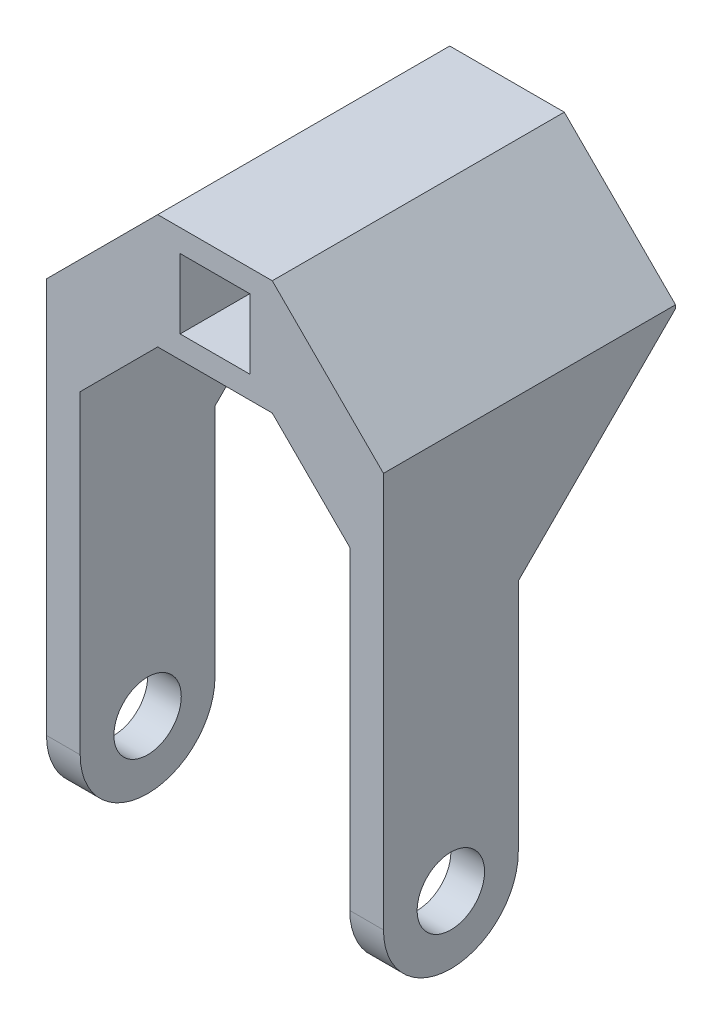
ISO-10303-21;
HEADER;
FILE_DESCRIPTION(('STEP AP214'),'2;1');
FILE_NAME('part.step','',(''),(''),'','','');
FILE_SCHEMA(('AUTOMOTIVE_DESIGN { 1 0 10303 214 1 1 1 1 }'));
ENDSEC;
DATA;
#1=APPLICATION_CONTEXT('core data for automotive mechanical design processes');
#2=APPLICATION_PROTOCOL_DEFINITION('international standard','automotive_design',2000,#1);
#3=PRODUCT_CONTEXT('',#1,'mechanical');
#4=PRODUCT('Part','Part','',(#3));
#5=PRODUCT_RELATED_PRODUCT_CATEGORY('part','',(#4));
#6=PRODUCT_DEFINITION_FORMATION('','',#4);
#7=PRODUCT_DEFINITION_CONTEXT('part definition',#1,'design');
#8=PRODUCT_DEFINITION('design','',#6,#7);
#9=PRODUCT_DEFINITION_SHAPE('','',#8);
#10=(LENGTH_UNIT() NAMED_UNIT(*) SI_UNIT(.MILLI.,.METRE.));
#11=(NAMED_UNIT(*) PLANE_ANGLE_UNIT() SI_UNIT($,.RADIAN.));
#12=(NAMED_UNIT(*) SI_UNIT($,.STERADIAN.) SOLID_ANGLE_UNIT());
#13=UNCERTAINTY_MEASURE_WITH_UNIT(LENGTH_MEASURE(1.E-05),#10,'distance_accuracy_value','');
#14=(GEOMETRIC_REPRESENTATION_CONTEXT(3) GLOBAL_UNCERTAINTY_ASSIGNED_CONTEXT((#13)) GLOBAL_UNIT_ASSIGNED_CONTEXT((#10,
#11,#12)) REPRESENTATION_CONTEXT('',''));
#15=CARTESIAN_POINT('',(0.,0.,0.));
#16=DIRECTION('',(0.,0.,1.));
#17=DIRECTION('',(1.,0.,0.));
#18=AXIS2_PLACEMENT_3D('',#15,#16,#17);
#19=CARTESIAN_POINT('',(-75.,176.,-100.));
#20=DIRECTION('',(-0.707106781186546,0.707106781186549,0.));
#21=DIRECTION('',(-0.707106781186549,-0.707106781186546,0.));
#22=AXIS2_PLACEMENT_3D('',#19,#20,#21);
#23=PLANE('',#22);
#24=DIRECTION('',(0.,0.,1.));
#25=VECTOR('',#24,1.);
#26=CARTESIAN_POINT('',(-75.,176.,-100.));
#27=LINE('',#26,#25);
#28=CARTESIAN_POINT('',(-75.,176.,-100.));
#29=VERTEX_POINT('',#28);
#30=CARTESIAN_POINT('',(-75.,176.,30.));
#31=VERTEX_POINT('',#30);
#32=EDGE_CURVE('E228',#29,#31,#27,.T.);
#33=ORIENTED_EDGE('',*,*,#32,.T.);
#34=DIRECTION('',(-0.707106781186549,-0.707106781186546,0.));
#35=VECTOR('',#34,1.);
#36=CARTESIAN_POINT('',(-75.,176.,30.));
#37=LINE('',#36,#35);
#38=CARTESIAN_POINT('',(-25.5,225.5,30.));
#39=VERTEX_POINT('',#38);
#40=EDGE_CURVE('E323',#39,#31,#37,.T.);
#41=ORIENTED_EDGE('',*,*,#40,.F.);
#42=DIRECTION('',(0.,0.,1.));
#43=VECTOR('',#42,1.);
#44=CARTESIAN_POINT('',(-25.5,225.5,-100.));
#45=LINE('',#44,#43);
#46=CARTESIAN_POINT('',(-25.5,225.5,-100.));
#47=VERTEX_POINT('',#46);
#48=EDGE_CURVE('E196',#47,#39,#45,.T.);
#49=ORIENTED_EDGE('',*,*,#48,.F.);
#50=DIRECTION('',(-0.707106781186549,-0.707106781186546,0.));
#51=VECTOR('',#50,1.);
#52=CARTESIAN_POINT('',(-75.,176.,-100.));
#53=LINE('',#52,#51);
#54=EDGE_CURVE('E369',#47,#29,#53,.T.);
#55=ORIENTED_EDGE('',*,*,#54,.T.);
#56=EDGE_LOOP('',(#33,#41,#49,#55));
#57=FACE_BOUND('',#56,.T.);
#58=ADVANCED_FACE('F38',(#57),#23,.T.);
#59=CARTESIAN_POINT('',(25.5,225.5,-100.));
#60=DIRECTION('',(0.,1.,0.));
#61=DIRECTION('',(0.,0.,1.));
#62=AXIS2_PLACEMENT_3D('',#59,#60,#61);
#63=PLANE('',#62);
#64=ORIENTED_EDGE('',*,*,#48,.T.);
#65=DIRECTION('',(-1.,0.,0.));
#66=VECTOR('',#65,1.);
#67=CARTESIAN_POINT('',(25.5,225.5,30.));
#68=LINE('',#67,#66);
#69=CARTESIAN_POINT('',(25.5,225.5,30.));
#70=VERTEX_POINT('',#69);
#71=EDGE_CURVE('E345',#70,#39,#68,.T.);
#72=ORIENTED_EDGE('',*,*,#71,.F.);
#73=DIRECTION('',(0.,0.,1.));
#74=VECTOR('',#73,1.);
#75=CARTESIAN_POINT('',(25.5,225.5,-100.));
#76=LINE('',#75,#74);
#77=CARTESIAN_POINT('',(25.5,225.5,-100.));
#78=VERTEX_POINT('',#77);
#79=EDGE_CURVE('E231',#78,#70,#76,.T.);
#80=ORIENTED_EDGE('',*,*,#79,.F.);
#81=DIRECTION('',(-1.,0.,0.));
#82=VECTOR('',#81,1.);
#83=CARTESIAN_POINT('',(25.5,225.5,-100.));
#84=LINE('',#83,#82);
#85=EDGE_CURVE('E218',#78,#47,#84,.T.);
#86=ORIENTED_EDGE('',*,*,#85,.T.);
#87=EDGE_LOOP('',(#64,#72,#80,#86));
#88=FACE_BOUND('',#87,.T.);
#89=ADVANCED_FACE('F393',(#88),#63,.T.);
#90=CARTESIAN_POINT('',(75.,176.,-100.));
#91=DIRECTION('',(0.707106781186546,0.707106781186549,0.));
#92=DIRECTION('',(-0.707106781186549,0.707106781186546,0.));
#93=AXIS2_PLACEMENT_3D('',#90,#91,#92);
#94=PLANE('',#93);
#95=ORIENTED_EDGE('',*,*,#79,.T.);
#96=DIRECTION('',(-0.707106781186549,0.707106781186546,0.));
#97=VECTOR('',#96,1.);
#98=CARTESIAN_POINT('',(75.,176.,30.));
#99=LINE('',#98,#97);
#100=CARTESIAN_POINT('',(75.,176.,30.));
#101=VERTEX_POINT('',#100);
#102=EDGE_CURVE('E341',#101,#70,#99,.T.);
#103=ORIENTED_EDGE('',*,*,#102,.F.);
#104=DIRECTION('',(0.,0.,1.));
#105=VECTOR('',#104,1.);
#106=CARTESIAN_POINT('',(75.,176.,-100.));
#107=LINE('',#106,#105);
#108=CARTESIAN_POINT('',(75.,176.,-100.));
#109=VERTEX_POINT('',#108);
#110=EDGE_CURVE('E234',#109,#101,#107,.T.);
#111=ORIENTED_EDGE('',*,*,#110,.F.);
#112=DIRECTION('',(-0.707106781186549,0.707106781186546,0.));
#113=VECTOR('',#112,1.);
#114=CARTESIAN_POINT('',(75.,176.,-100.));
#115=LINE('',#114,#113);
#116=EDGE_CURVE('E212',#109,#78,#115,.T.);
#117=ORIENTED_EDGE('',*,*,#116,.T.);
#118=EDGE_LOOP('',(#95,#103,#111,#117));
#119=FACE_BOUND('',#118,.T.);
#120=ADVANCED_FACE('F397',(#119),#94,.T.);
#121=CARTESIAN_POINT('',(75.,-30.,-100.));
#122=DIRECTION('',(1.,0.,0.));
#123=DIRECTION('',(0.,0.,-1.));
#124=AXIS2_PLACEMENT_3D('',#121,#122,#123);
#125=PLANE('',#124);
#126=CARTESIAN_POINT('',(75.,0.,0.));
#127=DIRECTION('',(1.,0.,0.));
#128=DIRECTION('',(0.,0.,-1.));
#129=AXIS2_PLACEMENT_3D('',#126,#127,#128);
#130=CIRCLE('',#129,15.);
#131=CARTESIAN_POINT('',(75.,0.,-15.));
#132=VERTEX_POINT('',#131);
#133=EDGE_CURVE('E285',#132,#132,#130,.T.);
#134=ORIENTED_EDGE('',*,*,#133,.F.);
#135=EDGE_LOOP('',(#134));
#136=FACE_BOUND('',#135,.T.);
#137=CARTESIAN_POINT('',(75.,0.,0.));
#138=DIRECTION('',(1.,0.,0.));
#139=DIRECTION('',(0.,0.,-1.));
#140=AXIS2_PLACEMENT_3D('',#137,#138,#139);
#141=CIRCLE('',#140,30.);
#142=CARTESIAN_POINT('',(75.,0.,30.));
#143=VERTEX_POINT('',#142);
#144=CARTESIAN_POINT('',(75.,-30.,0.));
#145=VERTEX_POINT('',#144);
#146=EDGE_CURVE('E195',#143,#145,#141,.T.);
#147=ORIENTED_EDGE('',*,*,#146,.T.);
#148=CARTESIAN_POINT('',(75.,0.,0.));
#149=DIRECTION('',(1.,0.,0.));
#150=DIRECTION('',(0.,0.,-1.));
#151=AXIS2_PLACEMENT_3D('',#148,#149,#150);
#152=CIRCLE('',#151,30.);
#153=CARTESIAN_POINT('',(75.,0.,-30.));
#154=VERTEX_POINT('',#153);
#155=EDGE_CURVE('E254',#145,#154,#152,.T.);
#156=ORIENTED_EDGE('',*,*,#155,.T.);
#157=DIRECTION('',(0.,-1.,0.));
#158=VECTOR('',#157,1.);
#159=CARTESIAN_POINT('',(75.,-30.,-30.));
#160=LINE('',#159,#158);
#161=CARTESIAN_POINT('',(75.,104.499999999999,-30.));
#162=VERTEX_POINT('',#161);
#163=EDGE_CURVE('E204',#162,#154,#160,.T.);
#164=ORIENTED_EDGE('',*,*,#163,.F.);
#165=DIRECTION('',(0.,-0.707106781186551,0.707106781186544));
#166=VECTOR('',#165,1.);
#167=CARTESIAN_POINT('',(75.,104.499999999999,-30.));
#168=LINE('',#167,#166);
#169=CARTESIAN_POINT('',(75.,174.5,-100.));
#170=VERTEX_POINT('',#169);
#171=EDGE_CURVE('E186',#170,#162,#168,.T.);
#172=ORIENTED_EDGE('',*,*,#171,.F.);
#173=DIRECTION('',(0.,1.,0.));
#174=VECTOR('',#173,1.);
#175=CARTESIAN_POINT('',(75.,-30.,-100.));
#176=LINE('',#175,#174);
#177=EDGE_CURVE('E201',#170,#109,#176,.T.);
#178=ORIENTED_EDGE('',*,*,#177,.T.);
#179=ORIENTED_EDGE('',*,*,#110,.T.);
#180=DIRECTION('',(0.,1.,0.));
#181=VECTOR('',#180,1.);
#182=CARTESIAN_POINT('',(75.,-30.,30.));
#183=LINE('',#182,#181);
#184=EDGE_CURVE('E338',#143,#101,#183,.T.);
#185=ORIENTED_EDGE('',*,*,#184,.F.);
#186=EDGE_LOOP('',(#147,#156,#164,#172,#178,#179,#185));
#187=FACE_BOUND('',#186,.T.);
#188=ADVANCED_FACE('F199',(#136,#187),#125,.T.);
#189=CARTESIAN_POINT('',(60.,140.,-100.));
#190=DIRECTION('',(-1.,0.,0.));
#191=DIRECTION('',(0.,-1.,0.));
#192=AXIS2_PLACEMENT_3D('',#189,#190,#191);
#193=PLANE('',#192);
#194=CARTESIAN_POINT('',(60.,0.,0.));
#195=DIRECTION('',(-1.,0.,0.));
#196=DIRECTION('',(0.,-1.,0.));
#197=AXIS2_PLACEMENT_3D('',#194,#195,#196);
#198=CIRCLE('',#197,15.);
#199=CARTESIAN_POINT('',(60.,-15.,0.));
#200=VERTEX_POINT('',#199);
#201=EDGE_CURVE('E206',#200,#200,#198,.T.);
#202=ORIENTED_EDGE('',*,*,#201,.F.);
#203=EDGE_LOOP('',(#202));
#204=FACE_BOUND('',#203,.T.);
#205=DIRECTION('',(0.,1.,0.));
#206=VECTOR('',#205,1.);
#207=CARTESIAN_POINT('',(60.,140.,-30.));
#208=LINE('',#207,#206);
#209=CARTESIAN_POINT('',(60.,0.,-30.));
#210=VERTEX_POINT('',#209);
#211=CARTESIAN_POINT('',(60.,104.499999999999,-30.));
#212=VERTEX_POINT('',#211);
#213=EDGE_CURVE('E439',#210,#212,#208,.T.);
#214=ORIENTED_EDGE('',*,*,#213,.F.);
#215=CARTESIAN_POINT('',(60.,0.,0.));
#216=DIRECTION('',(-1.,0.,0.));
#217=DIRECTION('',(0.,-1.,0.));
#218=AXIS2_PLACEMENT_3D('',#215,#216,#217);
#219=CIRCLE('',#218,30.);
#220=CARTESIAN_POINT('',(60.,-30.,0.));
#221=VERTEX_POINT('',#220);
#222=EDGE_CURVE('E264',#210,#221,#219,.T.);
#223=ORIENTED_EDGE('',*,*,#222,.T.);
#224=CARTESIAN_POINT('',(60.,0.,0.));
#225=DIRECTION('',(-1.,0.,0.));
#226=DIRECTION('',(0.,-1.,0.));
#227=AXIS2_PLACEMENT_3D('',#224,#225,#226);
#228=CIRCLE('',#227,30.);
#229=CARTESIAN_POINT('',(60.,0.,30.));
#230=VERTEX_POINT('',#229);
#231=EDGE_CURVE('E261',#221,#230,#228,.T.);
#232=ORIENTED_EDGE('',*,*,#231,.T.);
#233=DIRECTION('',(0.,-1.,0.));
#234=VECTOR('',#233,1.);
#235=CARTESIAN_POINT('',(60.,140.,30.));
#236=LINE('',#235,#234);
#237=CARTESIAN_POINT('',(60.,140.,30.));
#238=VERTEX_POINT('',#237);
#239=EDGE_CURVE('E334',#238,#230,#236,.T.);
#240=ORIENTED_EDGE('',*,*,#239,.F.);
#241=DIRECTION('',(0.,0.,1.));
#242=VECTOR('',#241,1.);
#243=CARTESIAN_POINT('',(60.,140.,-100.));
#244=LINE('',#243,#242);
#245=CARTESIAN_POINT('',(60.,140.,-65.5000000000006));
#246=VERTEX_POINT('',#245);
#247=EDGE_CURVE('E237',#246,#238,#244,.T.);
#248=ORIENTED_EDGE('',*,*,#247,.F.);
#249=DIRECTION('',(0.,0.707106781186551,-0.707106781186544));
#250=VECTOR('',#249,1.);
#251=CARTESIAN_POINT('',(60.,157.25,-82.7500000000001));
#252=LINE('',#251,#250);
#253=EDGE_CURVE('E432',#212,#246,#252,.T.);
#254=ORIENTED_EDGE('',*,*,#253,.F.);
#255=EDGE_LOOP('',(#214,#223,#232,#240,#248,#254));
#256=FACE_BOUND('',#255,.T.);
#257=ADVANCED_FACE('F585',(#204,#256),#193,.T.);
#258=CARTESIAN_POINT('',(25.5,174.5,-100.));
#259=DIRECTION('',(-0.707106781186546,-0.707106781186549,0.));
#260=DIRECTION('',(0.707106781186549,-0.707106781186546,0.));
#261=AXIS2_PLACEMENT_3D('',#258,#259,#260);
#262=PLANE('',#261);
#263=DIRECTION('',(-0.57735026918963,0.577350269189627,-0.577350269189621));
#264=VECTOR('',#263,1.);
#265=CARTESIAN_POINT('',(25.5,174.5,-100.));
#266=LINE('',#265,#264);
#267=CARTESIAN_POINT('',(25.5,174.5,-100.));
#268=VERTEX_POINT('',#267);
#269=EDGE_CURVE('E189',#246,#268,#266,.T.);
#270=ORIENTED_EDGE('',*,*,#269,.F.);
#271=ORIENTED_EDGE('',*,*,#247,.T.);
#272=DIRECTION('',(0.707106781186549,-0.707106781186546,0.));
#273=VECTOR('',#272,1.);
#274=CARTESIAN_POINT('',(25.5,174.5,30.));
#275=LINE('',#274,#273);
#276=CARTESIAN_POINT('',(25.5,174.5,30.));
#277=VERTEX_POINT('',#276);
#278=EDGE_CURVE('E330',#277,#238,#275,.T.);
#279=ORIENTED_EDGE('',*,*,#278,.F.);
#280=DIRECTION('',(0.,0.,1.));
#281=VECTOR('',#280,1.);
#282=CARTESIAN_POINT('',(25.5,174.5,-100.));
#283=LINE('',#282,#281);
#284=EDGE_CURVE('E240',#268,#277,#283,.T.);
#285=ORIENTED_EDGE('',*,*,#284,.F.);
#286=EDGE_LOOP('',(#270,#271,#279,#285));
#287=FACE_BOUND('',#286,.T.);
#288=ADVANCED_FACE('F589',(#287),#262,.T.);
#289=CARTESIAN_POINT('',(-25.5,174.5,-100.));
#290=DIRECTION('',(0.,-1.,0.));
#291=DIRECTION('',(0.,0.,-1.));
#292=AXIS2_PLACEMENT_3D('',#289,#290,#291);
#293=PLANE('',#292);
#294=ORIENTED_EDGE('',*,*,#284,.T.);
#295=DIRECTION('',(1.,0.,0.));
#296=VECTOR('',#295,1.);
#297=CARTESIAN_POINT('',(-25.5,174.5,30.));
#298=LINE('',#297,#296);
#299=CARTESIAN_POINT('',(-25.5,174.5,30.));
#300=VERTEX_POINT('',#299);
#301=EDGE_CURVE('E321',#300,#277,#298,.T.);
#302=ORIENTED_EDGE('',*,*,#301,.F.);
#303=DIRECTION('',(0.,0.,1.));
#304=VECTOR('',#303,1.);
#305=CARTESIAN_POINT('',(-25.5,174.5,-100.));
#306=LINE('',#305,#304);
#307=CARTESIAN_POINT('',(-25.5,174.5,-100.));
#308=VERTEX_POINT('',#307);
#309=EDGE_CURVE('E243',#308,#300,#306,.T.);
#310=ORIENTED_EDGE('',*,*,#309,.F.);
#311=DIRECTION('',(1.,0.,0.));
#312=VECTOR('',#311,1.);
#313=CARTESIAN_POINT('',(-25.5,174.5,-100.));
#314=LINE('',#313,#312);
#315=EDGE_CURVE('E214',#308,#268,#314,.T.);
#316=ORIENTED_EDGE('',*,*,#315,.T.);
#317=EDGE_LOOP('',(#294,#302,#310,#316));
#318=FACE_BOUND('',#317,.T.);
#319=ADVANCED_FACE('F650',(#318),#293,.T.);
#320=CARTESIAN_POINT('',(-25.5,174.5,-100.));
#321=DIRECTION('',(0.707106781186546,-0.707106781186549,0.));
#322=DIRECTION('',(0.707106781186549,0.707106781186546,0.));
#323=AXIS2_PLACEMENT_3D('',#320,#321,#322);
#324=PLANE('',#323);
#325=DIRECTION('',(-0.57735026918963,-0.577350269189627,0.577350269189621));
#326=VECTOR('',#325,1.);
#327=CARTESIAN_POINT('',(-25.5,174.5,-100.));
#328=LINE('',#327,#326);
#329=CARTESIAN_POINT('',(-60.,140.,-65.5000000000005));
#330=VERTEX_POINT('',#329);
#331=EDGE_CURVE('E427',#308,#330,#328,.T.);
#332=ORIENTED_EDGE('',*,*,#331,.F.);
#333=ORIENTED_EDGE('',*,*,#309,.T.);
#334=DIRECTION('',(0.707106781186549,0.707106781186546,0.));
#335=VECTOR('',#334,1.);
#336=CARTESIAN_POINT('',(-25.5,174.5,30.));
#337=LINE('',#336,#335);
#338=CARTESIAN_POINT('',(-60.,140.,30.));
#339=VERTEX_POINT('',#338);
#340=EDGE_CURVE('E317',#339,#300,#337,.T.);
#341=ORIENTED_EDGE('',*,*,#340,.F.);
#342=DIRECTION('',(0.,0.,1.));
#343=VECTOR('',#342,1.);
#344=CARTESIAN_POINT('',(-60.,140.,-100.));
#345=LINE('',#344,#343);
#346=EDGE_CURVE('E246',#330,#339,#345,.T.);
#347=ORIENTED_EDGE('',*,*,#346,.F.);
#348=EDGE_LOOP('',(#332,#333,#341,#347));
#349=FACE_BOUND('',#348,.T.);
#350=ADVANCED_FACE('F578',(#349),#324,.T.);
#351=CARTESIAN_POINT('',(-60.,140.,-100.));
#352=DIRECTION('',(1.,0.,0.));
#353=DIRECTION('',(0.,1.,0.));
#354=AXIS2_PLACEMENT_3D('',#351,#352,#353);
#355=PLANE('',#354);
#356=CARTESIAN_POINT('',(-60.,0.,0.));
#357=DIRECTION('',(1.,0.,0.));
#358=DIRECTION('',(0.,1.,0.));
#359=AXIS2_PLACEMENT_3D('',#356,#357,#358);
#360=CIRCLE('',#359,15.);
#361=CARTESIAN_POINT('',(-60.,15.,0.));
#362=VERTEX_POINT('',#361);
#363=EDGE_CURVE('E691',#362,#362,#360,.T.);
#364=ORIENTED_EDGE('',*,*,#363,.F.);
#365=EDGE_LOOP('',(#364));
#366=FACE_BOUND('',#365,.T.);
#367=CARTESIAN_POINT('',(-60.,0.,0.));
#368=DIRECTION('',(1.,0.,0.));
#369=DIRECTION('',(0.,1.,0.));
#370=AXIS2_PLACEMENT_3D('',#367,#368,#369);
#371=CIRCLE('',#370,30.);
#372=CARTESIAN_POINT('',(-60.,0.,30.));
#373=VERTEX_POINT('',#372);
#374=CARTESIAN_POINT('',(-60.,-30.,0.));
#375=VERTEX_POINT('',#374);
#376=EDGE_CURVE('E267',#373,#375,#371,.T.);
#377=ORIENTED_EDGE('',*,*,#376,.T.);
#378=CARTESIAN_POINT('',(-60.,0.,0.));
#379=DIRECTION('',(1.,0.,0.));
#380=DIRECTION('',(0.,1.,0.));
#381=AXIS2_PLACEMENT_3D('',#378,#379,#380);
#382=CIRCLE('',#381,30.);
#383=CARTESIAN_POINT('',(-60.,0.,-30.));
#384=VERTEX_POINT('',#383);
#385=EDGE_CURVE('E270',#375,#384,#382,.T.);
#386=ORIENTED_EDGE('',*,*,#385,.T.);
#387=DIRECTION('',(0.,-1.,0.));
#388=VECTOR('',#387,1.);
#389=CARTESIAN_POINT('',(-60.,140.,-30.));
#390=LINE('',#389,#388);
#391=CARTESIAN_POINT('',(-60.,104.499999999999,-30.));
#392=VERTEX_POINT('',#391);
#393=EDGE_CURVE('E435',#392,#384,#390,.T.);
#394=ORIENTED_EDGE('',*,*,#393,.F.);
#395=DIRECTION('',(0.,-0.707106781186551,0.707106781186544));
#396=VECTOR('',#395,1.);
#397=CARTESIAN_POINT('',(-60.,157.25,-82.7500000000001));
#398=LINE('',#397,#396);
#399=EDGE_CURVE('E422',#330,#392,#398,.T.);
#400=ORIENTED_EDGE('',*,*,#399,.F.);
#401=ORIENTED_EDGE('',*,*,#346,.T.);
#402=DIRECTION('',(0.,1.,0.));
#403=VECTOR('',#402,1.);
#404=CARTESIAN_POINT('',(-60.,140.,30.));
#405=LINE('',#404,#403);
#406=EDGE_CURVE('E308',#373,#339,#405,.T.);
#407=ORIENTED_EDGE('',*,*,#406,.F.);
#408=EDGE_LOOP('',(#377,#386,#394,#400,#401,#407));
#409=FACE_BOUND('',#408,.T.);
#410=ADVANCED_FACE('F312',(#366,#409),#355,.T.);
#411=CARTESIAN_POINT('',(-75.,-30.,-100.));
#412=DIRECTION('',(-1.,0.,0.));
#413=DIRECTION('',(0.,0.,1.));
#414=AXIS2_PLACEMENT_3D('',#411,#412,#413);
#415=PLANE('',#414);
#416=CARTESIAN_POINT('',(-75.,0.,0.));
#417=DIRECTION('',(1.,0.,0.));
#418=DIRECTION('',(0.,0.,-1.));
#419=AXIS2_PLACEMENT_3D('',#416,#417,#418);
#420=CIRCLE('',#419,15.);
#421=CARTESIAN_POINT('',(-75.,0.,-15.));
#422=VERTEX_POINT('',#421);
#423=EDGE_CURVE('E292',#422,#422,#420,.T.);
#424=ORIENTED_EDGE('',*,*,#423,.T.);
#425=EDGE_LOOP('',(#424));
#426=FACE_BOUND('',#425,.T.);
#427=DIRECTION('',(0.,-1.,0.));
#428=VECTOR('',#427,1.);
#429=CARTESIAN_POINT('',(-75.,-30.,-30.));
#430=LINE('',#429,#428);
#431=CARTESIAN_POINT('',(-75.,104.499999999999,-30.));
#432=VERTEX_POINT('',#431);
#433=CARTESIAN_POINT('',(-75.,0.,-30.));
#434=VERTEX_POINT('',#433);
#435=EDGE_CURVE('E412',#432,#434,#430,.T.);
#436=ORIENTED_EDGE('',*,*,#435,.T.);
#437=CARTESIAN_POINT('',(-75.,0.,0.));
#438=DIRECTION('',(-1.,0.,0.));
#439=DIRECTION('',(0.,0.,1.));
#440=AXIS2_PLACEMENT_3D('',#437,#438,#439);
#441=CIRCLE('',#440,30.);
#442=CARTESIAN_POINT('',(-75.,-30.,0.));
#443=VERTEX_POINT('',#442);
#444=EDGE_CURVE('E61',#434,#443,#441,.T.);
#445=ORIENTED_EDGE('',*,*,#444,.T.);
#446=CARTESIAN_POINT('',(-75.,0.,0.));
#447=DIRECTION('',(-1.,0.,0.));
#448=DIRECTION('',(0.,0.,1.));
#449=AXIS2_PLACEMENT_3D('',#446,#447,#448);
#450=CIRCLE('',#449,30.);
#451=CARTESIAN_POINT('',(-75.,0.,30.));
#452=VERTEX_POINT('',#451);
#453=EDGE_CURVE('E56',#443,#452,#450,.T.);
#454=ORIENTED_EDGE('',*,*,#453,.T.);
#455=DIRECTION('',(0.,-1.,0.));
#456=VECTOR('',#455,1.);
#457=CARTESIAN_POINT('',(-75.,-30.,30.));
#458=LINE('',#457,#456);
#459=EDGE_CURVE('E310',#31,#452,#458,.T.);
#460=ORIENTED_EDGE('',*,*,#459,.F.);
#461=ORIENTED_EDGE('',*,*,#32,.F.);
#462=DIRECTION('',(0.,-1.,0.));
#463=VECTOR('',#462,1.);
#464=CARTESIAN_POINT('',(-75.,-30.,-100.));
#465=LINE('',#464,#463);
#466=CARTESIAN_POINT('',(-75.,174.5,-100.));
#467=VERTEX_POINT('',#466);
#468=EDGE_CURVE('E221',#29,#467,#465,.T.);
#469=ORIENTED_EDGE('',*,*,#468,.T.);
#470=DIRECTION('',(0.,-0.707106781186551,0.707106781186544));
#471=VECTOR('',#470,1.);
#472=CARTESIAN_POINT('',(-75.,104.499999999999,-30.));
#473=LINE('',#472,#471);
#474=EDGE_CURVE('E385',#467,#432,#473,.T.);
#475=ORIENTED_EDGE('',*,*,#474,.T.);
#476=EDGE_LOOP('',(#436,#445,#454,#460,#461,#469,#475));
#477=FACE_BOUND('',#476,.T.);
#478=ADVANCED_FACE('F384',(#426,#477),#415,.T.);
#479=CARTESIAN_POINT('',(0.,0.,-100.));
#480=DIRECTION('',(0.,0.,1.));
#481=DIRECTION('',(1.,0.,0.));
#482=AXIS2_PLACEMENT_3D('',#479,#480,#481);
#483=PLANE('',#482);
#484=DIRECTION('',(1.,0.,0.));
#485=VECTOR('',#484,1.);
#486=CARTESIAN_POINT('',(-15.5,184.5,-100.));
#487=LINE('',#486,#485);
#488=CARTESIAN_POINT('',(-15.5,184.5,-100.));
#489=VERTEX_POINT('',#488);
#490=CARTESIAN_POINT('',(15.5,184.5,-100.));
#491=VERTEX_POINT('',#490);
#492=EDGE_CURVE('E361',#489,#491,#487,.T.);
#493=ORIENTED_EDGE('',*,*,#492,.T.);
#494=DIRECTION('',(0.,1.,0.));
#495=VECTOR('',#494,1.);
#496=CARTESIAN_POINT('',(15.5,215.5,-100.));
#497=LINE('',#496,#495);
#498=CARTESIAN_POINT('',(15.5,215.5,-100.));
#499=VERTEX_POINT('',#498);
#500=EDGE_CURVE('E349',#491,#499,#497,.T.);
#501=ORIENTED_EDGE('',*,*,#500,.T.);
#502=DIRECTION('',(-1.,0.,0.));
#503=VECTOR('',#502,1.);
#504=CARTESIAN_POINT('',(-15.5,215.5,-100.));
#505=LINE('',#504,#503);
#506=CARTESIAN_POINT('',(-15.5,215.5,-100.));
#507=VERTEX_POINT('',#506);
#508=EDGE_CURVE('E353',#499,#507,#505,.T.);
#509=ORIENTED_EDGE('',*,*,#508,.T.);
#510=DIRECTION('',(0.,-1.,0.));
#511=VECTOR('',#510,1.);
#512=CARTESIAN_POINT('',(-15.5,215.5,-100.));
#513=LINE('',#512,#511);
#514=EDGE_CURVE('E357',#507,#489,#513,.T.);
#515=ORIENTED_EDGE('',*,*,#514,.T.);
#516=EDGE_LOOP('',(#493,#501,#509,#515));
#517=FACE_BOUND('',#516,.T.);
#518=ORIENTED_EDGE('',*,*,#177,.F.);
#519=DIRECTION('',(-1.,0.,0.));
#520=VECTOR('',#519,1.);
#521=CARTESIAN_POINT('',(0.,174.5,-100.));
#522=LINE('',#521,#520);
#523=EDGE_CURVE('E182',#170,#268,#522,.T.);
#524=ORIENTED_EDGE('',*,*,#523,.T.);
#525=ORIENTED_EDGE('',*,*,#315,.F.);
#526=DIRECTION('',(1.,0.,0.));
#527=VECTOR('',#526,1.);
#528=CARTESIAN_POINT('',(-75.,174.5,-100.));
#529=LINE('',#528,#527);
#530=EDGE_CURVE('E388',#467,#308,#529,.T.);
#531=ORIENTED_EDGE('',*,*,#530,.F.);
#532=ORIENTED_EDGE('',*,*,#468,.F.);
#533=ORIENTED_EDGE('',*,*,#54,.F.);
#534=ORIENTED_EDGE('',*,*,#85,.F.);
#535=ORIENTED_EDGE('',*,*,#116,.F.);
#536=EDGE_LOOP('',(#518,#524,#525,#531,#532,#533,#534,#535));
#537=FACE_BOUND('',#536,.T.);
#538=ADVANCED_FACE('F209',(#517,#537),#483,.F.);
#539=CARTESIAN_POINT('',(15.5,215.5,-100.));
#540=DIRECTION('',(1.,0.,0.));
#541=DIRECTION('',(0.,1.,0.));
#542=AXIS2_PLACEMENT_3D('',#539,#540,#541);
#543=PLANE('',#542);
#544=DIRECTION('',(0.,0.,1.));
#545=VECTOR('',#544,1.);
#546=CARTESIAN_POINT('',(15.5,184.5,-100.));
#547=LINE('',#546,#545);
#548=CARTESIAN_POINT('',(15.5,184.5,30.));
#549=VERTEX_POINT('',#548);
#550=EDGE_CURVE('E366',#491,#549,#547,.T.);
#551=ORIENTED_EDGE('',*,*,#550,.T.);
#552=DIRECTION('',(0.,1.,0.));
#553=VECTOR('',#552,1.);
#554=CARTESIAN_POINT('',(15.5,215.5,30.));
#555=LINE('',#554,#553);
#556=CARTESIAN_POINT('',(15.5,215.5,30.));
#557=VERTEX_POINT('',#556);
#558=EDGE_CURVE('E442',#549,#557,#555,.T.);
#559=ORIENTED_EDGE('',*,*,#558,.T.);
#560=DIRECTION('',(0.,0.,1.));
#561=VECTOR('',#560,1.);
#562=CARTESIAN_POINT('',(15.5,215.5,-100.));
#563=LINE('',#562,#561);
#564=EDGE_CURVE('E365',#499,#557,#563,.T.);
#565=ORIENTED_EDGE('',*,*,#564,.F.);
#566=ORIENTED_EDGE('',*,*,#500,.F.);
#567=EDGE_LOOP('',(#551,#559,#565,#566));
#568=FACE_BOUND('',#567,.T.);
#569=ADVANCED_FACE('F468',(#568),#543,.F.);
#570=CARTESIAN_POINT('',(-15.5,184.5,-100.));
#571=DIRECTION('',(0.,-1.,0.));
#572=DIRECTION('',(0.,0.,-1.));
#573=AXIS2_PLACEMENT_3D('',#570,#571,#572);
#574=PLANE('',#573);
#575=DIRECTION('',(0.,0.,1.));
#576=VECTOR('',#575,1.);
#577=CARTESIAN_POINT('',(-15.5,184.5,-100.));
#578=LINE('',#577,#576);
#579=CARTESIAN_POINT('',(-15.5,184.5,30.));
#580=VERTEX_POINT('',#579);
#581=EDGE_CURVE('E370',#489,#580,#578,.T.);
#582=ORIENTED_EDGE('',*,*,#581,.T.);
#583=DIRECTION('',(1.,0.,0.));
#584=VECTOR('',#583,1.);
#585=CARTESIAN_POINT('',(-15.5,184.5,30.));
#586=LINE('',#585,#584);
#587=EDGE_CURVE('E454',#580,#549,#586,.T.);
#588=ORIENTED_EDGE('',*,*,#587,.T.);
#589=ORIENTED_EDGE('',*,*,#550,.F.);
#590=ORIENTED_EDGE('',*,*,#492,.F.);
#591=EDGE_LOOP('',(#582,#588,#589,#590));
#592=FACE_BOUND('',#591,.T.);
#593=ADVANCED_FACE('F462',(#592),#574,.F.);
#594=CARTESIAN_POINT('',(-15.5,215.5,-100.));
#595=DIRECTION('',(-1.,0.,0.));
#596=DIRECTION('',(0.,-1.,0.));
#597=AXIS2_PLACEMENT_3D('',#594,#595,#596);
#598=PLANE('',#597);
#599=DIRECTION('',(0.,0.,1.));
#600=VECTOR('',#599,1.);
#601=CARTESIAN_POINT('',(-15.5,215.5,-100.));
#602=LINE('',#601,#600);
#603=CARTESIAN_POINT('',(-15.5,215.5,30.));
#604=VERTEX_POINT('',#603);
#605=EDGE_CURVE('E373',#507,#604,#602,.T.);
#606=ORIENTED_EDGE('',*,*,#605,.T.);
#607=DIRECTION('',(0.,-1.,0.));
#608=VECTOR('',#607,1.);
#609=CARTESIAN_POINT('',(-15.5,215.5,30.));
#610=LINE('',#609,#608);
#611=EDGE_CURVE('E450',#604,#580,#610,.T.);
#612=ORIENTED_EDGE('',*,*,#611,.T.);
#613=ORIENTED_EDGE('',*,*,#581,.F.);
#614=ORIENTED_EDGE('',*,*,#514,.F.);
#615=EDGE_LOOP('',(#606,#612,#613,#614));
#616=FACE_BOUND('',#615,.T.);
#617=ADVANCED_FACE('F473',(#616),#598,.F.);
#618=CARTESIAN_POINT('',(-15.5,215.5,-100.));
#619=DIRECTION('',(0.,1.,0.));
#620=DIRECTION('',(0.,0.,1.));
#621=AXIS2_PLACEMENT_3D('',#618,#619,#620);
#622=PLANE('',#621);
#623=ORIENTED_EDGE('',*,*,#564,.T.);
#624=DIRECTION('',(-1.,0.,0.));
#625=VECTOR('',#624,1.);
#626=CARTESIAN_POINT('',(-15.5,215.5,30.));
#627=LINE('',#626,#625);
#628=EDGE_CURVE('E446',#557,#604,#627,.T.);
#629=ORIENTED_EDGE('',*,*,#628,.T.);
#630=ORIENTED_EDGE('',*,*,#605,.F.);
#631=ORIENTED_EDGE('',*,*,#508,.F.);
#632=EDGE_LOOP('',(#623,#629,#630,#631));
#633=FACE_BOUND('',#632,.T.);
#634=ADVANCED_FACE('F475',(#633),#622,.F.);
#635=CARTESIAN_POINT('',(0.,0.,30.));
#636=DIRECTION('',(0.,0.,1.));
#637=DIRECTION('',(1.,0.,0.));
#638=AXIS2_PLACEMENT_3D('',#635,#636,#637);
#639=PLANE('',#638);
#640=ORIENTED_EDGE('',*,*,#459,.T.);
#641=DIRECTION('',(1.,0.,0.));
#642=VECTOR('',#641,1.);
#643=CARTESIAN_POINT('',(0.,0.,30.));
#644=LINE('',#643,#642);
#645=EDGE_CURVE('E11',#452,#373,#644,.T.);
#646=ORIENTED_EDGE('',*,*,#645,.T.);
#647=ORIENTED_EDGE('',*,*,#406,.T.);
#648=ORIENTED_EDGE('',*,*,#340,.T.);
#649=ORIENTED_EDGE('',*,*,#301,.T.);
#650=ORIENTED_EDGE('',*,*,#278,.T.);
#651=ORIENTED_EDGE('',*,*,#239,.T.);
#652=DIRECTION('',(1.,0.,0.));
#653=VECTOR('',#652,1.);
#654=CARTESIAN_POINT('',(0.,0.,30.));
#655=LINE('',#654,#653);
#656=EDGE_CURVE('E48',#230,#143,#655,.T.);
#657=ORIENTED_EDGE('',*,*,#656,.T.);
#658=ORIENTED_EDGE('',*,*,#184,.T.);
#659=ORIENTED_EDGE('',*,*,#102,.T.);
#660=ORIENTED_EDGE('',*,*,#71,.T.);
#661=ORIENTED_EDGE('',*,*,#40,.T.);
#662=EDGE_LOOP('',(#640,#646,#647,#648,#649,#650,#651,#657,#658,#659,#660,#661));
#663=FACE_BOUND('',#662,.T.);
#664=ORIENTED_EDGE('',*,*,#628,.F.);
#665=ORIENTED_EDGE('',*,*,#558,.F.);
#666=ORIENTED_EDGE('',*,*,#587,.F.);
#667=ORIENTED_EDGE('',*,*,#611,.F.);
#668=EDGE_LOOP('',(#664,#665,#666,#667));
#669=FACE_BOUND('',#668,.T.);
#670=ADVANCED_FACE('F305',(#663,#669),#639,.T.);
#671=CARTESIAN_POINT('',(-75.,104.499999999999,-30.));
#672=DIRECTION('',(0.,0.707106781186544,0.707106781186551));
#673=DIRECTION('',(0.,-0.707106781186551,0.707106781186544));
#674=AXIS2_PLACEMENT_3D('',#671,#672,#673);
#675=PLANE('',#674);
#676=ORIENTED_EDGE('',*,*,#331,.T.);
#677=ORIENTED_EDGE('',*,*,#399,.T.);
#678=DIRECTION('',(1.,0.,0.));
#679=VECTOR('',#678,1.);
#680=CARTESIAN_POINT('',(-75.,104.499999999999,-30.));
#681=LINE('',#680,#679);
#682=EDGE_CURVE('E418',#432,#392,#681,.T.);
#683=ORIENTED_EDGE('',*,*,#682,.F.);
#684=ORIENTED_EDGE('',*,*,#474,.F.);
#685=ORIENTED_EDGE('',*,*,#530,.T.);
#686=EDGE_LOOP('',(#676,#677,#683,#684,#685));
#687=FACE_BOUND('',#686,.T.);
#688=ADVANCED_FACE('F482',(#687),#675,.F.);
#689=CARTESIAN_POINT('',(-75.,-30.,-30.));
#690=DIRECTION('',(0.,0.,1.));
#691=DIRECTION('',(1.,0.,0.));
#692=AXIS2_PLACEMENT_3D('',#689,#690,#691);
#693=PLANE('',#692);
#694=ORIENTED_EDGE('',*,*,#393,.T.);
#695=DIRECTION('',(1.,0.,0.));
#696=VECTOR('',#695,1.);
#697=CARTESIAN_POINT('',(-75.,0.,-30.));
#698=LINE('',#697,#696);
#699=EDGE_CURVE('E273',#384,#434,#698,.F.);
#700=ORIENTED_EDGE('',*,*,#699,.T.);
#701=ORIENTED_EDGE('',*,*,#435,.F.);
#702=ORIENTED_EDGE('',*,*,#682,.T.);
#703=EDGE_LOOP('',(#694,#700,#701,#702));
#704=FACE_BOUND('',#703,.T.);
#705=ADVANCED_FACE('F541',(#704),#693,.F.);
#706=ORIENTED_EDGE('',*,*,#163,.T.);
#707=DIRECTION('',(1.,0.,0.));
#708=VECTOR('',#707,1.);
#709=CARTESIAN_POINT('',(60.,0.,-30.));
#710=LINE('',#709,#708);
#711=EDGE_CURVE('E257',#154,#210,#710,.F.);
#712=ORIENTED_EDGE('',*,*,#711,.T.);
#713=ORIENTED_EDGE('',*,*,#213,.T.);
#714=EDGE_CURVE('E408',#212,#162,#681,.T.);
#715=ORIENTED_EDGE('',*,*,#714,.T.);
#716=EDGE_LOOP('',(#706,#712,#713,#715));
#717=FACE_BOUND('',#716,.T.);
#718=ADVANCED_FACE('F406',(#717),#693,.F.);
#719=ORIENTED_EDGE('',*,*,#253,.T.);
#720=ORIENTED_EDGE('',*,*,#269,.T.);
#721=ORIENTED_EDGE('',*,*,#523,.F.);
#722=ORIENTED_EDGE('',*,*,#171,.T.);
#723=ORIENTED_EDGE('',*,*,#714,.F.);
#724=EDGE_LOOP('',(#719,#720,#721,#722,#723));
#725=FACE_BOUND('',#724,.T.);
#726=ADVANCED_FACE('F184',(#725),#675,.F.);
#727=CARTESIAN_POINT('',(-75.,0.,0.));
#728=DIRECTION('',(1.,0.,0.));
#729=DIRECTION('',(0.,0.,-1.));
#730=AXIS2_PLACEMENT_3D('',#727,#728,#729);
#731=CYLINDRICAL_SURFACE('',#730,15.);
#732=ORIENTED_EDGE('',*,*,#363,.T.);
#733=EDGE_LOOP('',(#732));
#734=FACE_BOUND('',#733,.T.);
#735=ORIENTED_EDGE('',*,*,#423,.F.);
#736=EDGE_LOOP('',(#735));
#737=FACE_BOUND('',#736,.T.);
#738=ADVANCED_FACE('F520',(#734,#737),#731,.F.);
#739=ORIENTED_EDGE('',*,*,#201,.T.);
#740=EDGE_LOOP('',(#739));
#741=FACE_BOUND('',#740,.T.);
#742=ORIENTED_EDGE('',*,*,#133,.T.);
#743=EDGE_LOOP('',(#742));
#744=FACE_BOUND('',#743,.T.);
#745=ADVANCED_FACE('F498',(#741,#744),#731,.F.);
#746=CARTESIAN_POINT('',(0.,0.,0.));
#747=DIRECTION('',(1.,0.,0.));
#748=DIRECTION('',(0.,0.,-1.));
#749=AXIS2_PLACEMENT_3D('',#746,#747,#748);
#750=CYLINDRICAL_SURFACE('',#749,30.);
#751=ORIENTED_EDGE('',*,*,#656,.F.);
#752=ORIENTED_EDGE('',*,*,#231,.F.);
#753=DIRECTION('',(1.,0.,0.));
#754=VECTOR('',#753,1.);
#755=CARTESIAN_POINT('',(60.,-30.,0.));
#756=LINE('',#755,#754);
#757=EDGE_CURVE('E282',#145,#221,#756,.F.);
#758=ORIENTED_EDGE('',*,*,#757,.F.);
#759=ORIENTED_EDGE('',*,*,#146,.F.);
#760=EDGE_LOOP('',(#751,#752,#758,#759));
#761=FACE_BOUND('',#760,.T.);
#762=ADVANCED_FACE('F401',(#761),#750,.T.);
#763=CARTESIAN_POINT('',(60.,0.,0.));
#764=DIRECTION('',(-1.,0.,0.));
#765=DIRECTION('',(0.,0.,1.));
#766=AXIS2_PLACEMENT_3D('',#763,#764,#765);
#767=CYLINDRICAL_SURFACE('',#766,30.);
#768=ORIENTED_EDGE('',*,*,#222,.F.);
#769=ORIENTED_EDGE('',*,*,#711,.F.);
#770=ORIENTED_EDGE('',*,*,#155,.F.);
#771=ORIENTED_EDGE('',*,*,#757,.T.);
#772=EDGE_LOOP('',(#768,#769,#770,#771));
#773=FACE_BOUND('',#772,.T.);
#774=ADVANCED_FACE('F404',(#773),#767,.T.);
#775=CARTESIAN_POINT('',(0.,0.,0.));
#776=DIRECTION('',(1.,0.,0.));
#777=DIRECTION('',(0.,0.,-1.));
#778=AXIS2_PLACEMENT_3D('',#775,#776,#777);
#779=CYLINDRICAL_SURFACE('',#778,30.);
#780=ORIENTED_EDGE('',*,*,#645,.F.);
#781=ORIENTED_EDGE('',*,*,#453,.F.);
#782=DIRECTION('',(1.,0.,0.));
#783=VECTOR('',#782,1.);
#784=CARTESIAN_POINT('',(-60.,-30.,0.));
#785=LINE('',#784,#783);
#786=EDGE_CURVE('E42',#375,#443,#785,.F.);
#787=ORIENTED_EDGE('',*,*,#786,.F.);
#788=ORIENTED_EDGE('',*,*,#376,.F.);
#789=EDGE_LOOP('',(#780,#781,#787,#788));
#790=FACE_BOUND('',#789,.T.);
#791=ADVANCED_FACE('F40',(#790),#779,.T.);
#792=CARTESIAN_POINT('',(-60.,0.,0.));
#793=DIRECTION('',(-1.,0.,0.));
#794=DIRECTION('',(0.,0.,1.));
#795=AXIS2_PLACEMENT_3D('',#792,#793,#794);
#796=CYLINDRICAL_SURFACE('',#795,30.);
#797=ORIENTED_EDGE('',*,*,#444,.F.);
#798=ORIENTED_EDGE('',*,*,#699,.F.);
#799=ORIENTED_EDGE('',*,*,#385,.F.);
#800=ORIENTED_EDGE('',*,*,#786,.T.);
#801=EDGE_LOOP('',(#797,#798,#799,#800));
#802=FACE_BOUND('',#801,.T.);
#803=ADVANCED_FACE('F298',(#802),#796,.T.);
#804=CLOSED_SHELL('',(#58,#89,#120,#188,#257,#288,#319,#350,#410,#478,#538,#569,#593,#617,#634,
#670,#688,#705,#718,#726,#738,#745,#762,#774,#791,#803));
#805=MANIFOLD_SOLID_BREP('B2',#804);
#806=ADVANCED_BREP_SHAPE_REPRESENTATION('',(#18,#805),#14);
#807=SHAPE_DEFINITION_REPRESENTATION(#9,#806);
ENDSEC;
END-ISO-10303-21;
